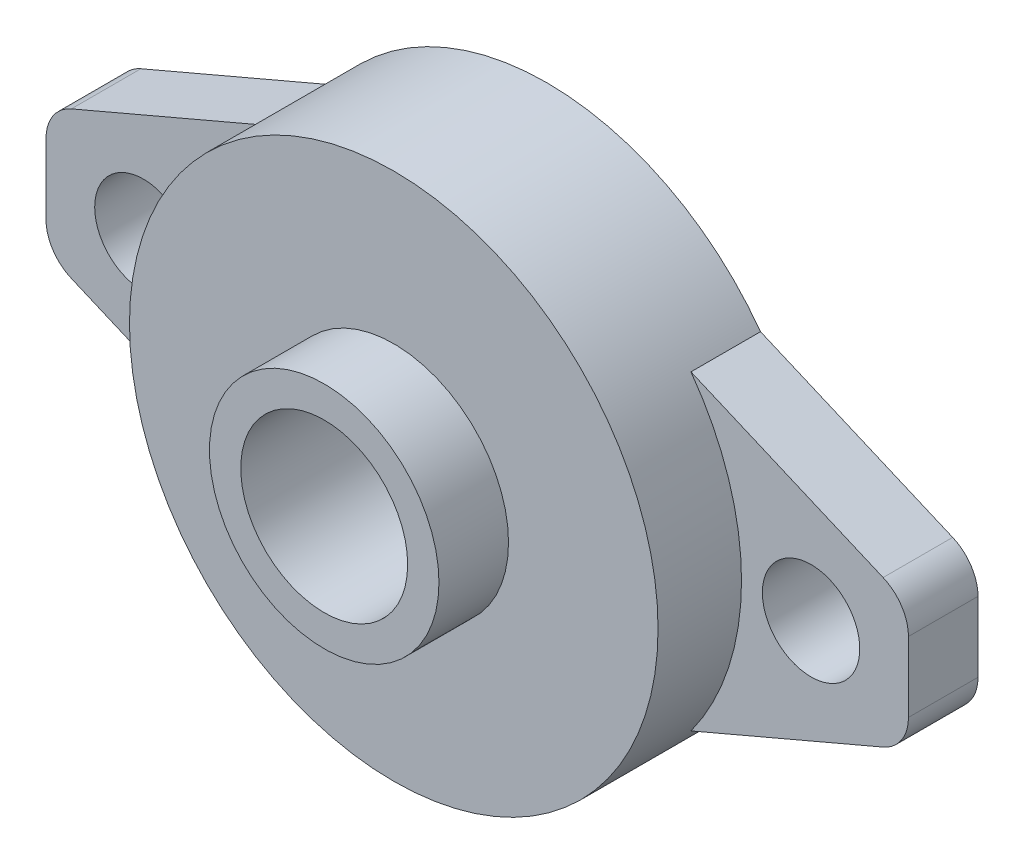
ISO-10303-21;
HEADER;
FILE_DESCRIPTION(('STEP AP214'),'2;1');
FILE_NAME('part.step','',(''),(''),'','','');
FILE_SCHEMA(('AUTOMOTIVE_DESIGN { 1 0 10303 214 1 1 1 1 }'));
ENDSEC;
DATA;
#1=APPLICATION_CONTEXT('core data for automotive mechanical design processes');
#2=APPLICATION_PROTOCOL_DEFINITION('international standard','automotive_design',2000,#1);
#3=PRODUCT_CONTEXT('',#1,'mechanical');
#4=PRODUCT('Part','Part','',(#3));
#5=PRODUCT_RELATED_PRODUCT_CATEGORY('part','',(#4));
#6=PRODUCT_DEFINITION_FORMATION('','',#4);
#7=PRODUCT_DEFINITION_CONTEXT('part definition',#1,'design');
#8=PRODUCT_DEFINITION('design','',#6,#7);
#9=PRODUCT_DEFINITION_SHAPE('','',#8);
#10=(LENGTH_UNIT() NAMED_UNIT(*) SI_UNIT(.MILLI.,.METRE.));
#11=(NAMED_UNIT(*) PLANE_ANGLE_UNIT() SI_UNIT($,.RADIAN.));
#12=(NAMED_UNIT(*) SI_UNIT($,.STERADIAN.) SOLID_ANGLE_UNIT());
#13=UNCERTAINTY_MEASURE_WITH_UNIT(LENGTH_MEASURE(1.E-05),#10,'distance_accuracy_value','');
#14=(GEOMETRIC_REPRESENTATION_CONTEXT(3) GLOBAL_UNCERTAINTY_ASSIGNED_CONTEXT((#13)) GLOBAL_UNIT_ASSIGNED_CONTEXT((#10,
#11,#12)) REPRESENTATION_CONTEXT('',''));
#15=CARTESIAN_POINT('',(0.,0.,0.));
#16=DIRECTION('',(0.,0.,1.));
#17=DIRECTION('',(1.,0.,0.));
#18=AXIS2_PLACEMENT_3D('',#15,#16,#17);
#19=CARTESIAN_POINT('',(0.,0.,11.));
#20=DIRECTION('',(0.,0.,1.));
#21=DIRECTION('',(1.,0.,0.));
#22=AXIS2_PLACEMENT_3D('',#19,#20,#21);
#23=PLANE('',#22);
#24=CARTESIAN_POINT('',(0.,0.,11.));
#25=DIRECTION('',(0.,0.,1.));
#26=DIRECTION('',(1.,0.,0.));
#27=AXIS2_PLACEMENT_3D('',#24,#25,#26);
#28=CIRCLE('',#27,19.);
#29=CARTESIAN_POINT('',(19.,0.,11.));
#30=VERTEX_POINT('',#29);
#31=EDGE_CURVE('E208',#30,#30,#28,.T.);
#32=ORIENTED_EDGE('',*,*,#31,.T.);
#33=EDGE_LOOP('',(#32));
#34=FACE_BOUND('',#33,.T.);
#35=CARTESIAN_POINT('',(0.,0.,11.));
#36=DIRECTION('',(0.,0.,1.));
#37=DIRECTION('',(1.,0.,0.));
#38=AXIS2_PLACEMENT_3D('',#35,#36,#37);
#39=CIRCLE('',#38,8.25);
#40=CARTESIAN_POINT('',(8.25,0.,11.));
#41=VERTEX_POINT('',#40);
#42=EDGE_CURVE('E200',#41,#41,#39,.T.);
#43=ORIENTED_EDGE('',*,*,#42,.F.);
#44=EDGE_LOOP('',(#43));
#45=FACE_BOUND('',#44,.T.);
#46=ADVANCED_FACE('F33',(#34,#45),#23,.T.);
#47=CARTESIAN_POINT('',(0.,0.,0.));
#48=DIRECTION('',(0.,0.,1.));
#49=DIRECTION('',(1.,0.,0.));
#50=AXIS2_PLACEMENT_3D('',#47,#48,#49);
#51=PLANE('',#50);
#52=DIRECTION('',(3.13792202098916E-13,-1.,0.));
#53=VECTOR('',#52,1.);
#54=CARTESIAN_POINT('',(31.0000000000035,-4.49999999999506,0.));
#55=LINE('',#54,#53);
#56=CARTESIAN_POINT('',(31.0000000000013,2.51904148439057,0.));
#57=VERTEX_POINT('',#56);
#58=CARTESIAN_POINT('',(31.0000000000028,-2.51904148437958,0.));
#59=VERTEX_POINT('',#58);
#60=EDGE_CURVE('E190',#57,#59,#55,.T.);
#61=ORIENTED_EDGE('',*,*,#60,.T.);
#62=CARTESIAN_POINT('',(28.0000000000028,-2.51904148438053,0.));
#63=DIRECTION('',(0.,0.,1.));
#64=DIRECTION('',(1.,0.,0.));
#65=AXIS2_PLACEMENT_3D('',#62,#63,#64);
#66=CIRCLE('',#65,3.);
#67=CARTESIAN_POINT('',(29.1782094084252,-5.27799465359256,0.));
#68=VERTEX_POINT('',#67);
#69=EDGE_CURVE('E222',#59,#68,#66,.F.);
#70=ORIENTED_EDGE('',*,*,#69,.T.);
#71=DIRECTION('',(-0.91965105640401,-0.392736469474109,0.));
#72=VECTOR('',#71,1.);
#73=CARTESIAN_POINT('',(15.3646827155619,-11.1770535048425,0.));
#74=LINE('',#73,#72);
#75=CARTESIAN_POINT('',(15.3646827155619,-11.1770535048425,0.));
#76=VERTEX_POINT('',#75);
#77=EDGE_CURVE('E130',#68,#76,#74,.T.);
#78=ORIENTED_EDGE('',*,*,#77,.T.);
#79=CARTESIAN_POINT('',(0.,0.,0.));
#80=DIRECTION('',(0.,0.,1.));
#81=DIRECTION('',(1.,0.,0.));
#82=AXIS2_PLACEMENT_3D('',#79,#80,#81);
#83=CIRCLE('',#82,19.);
#84=CARTESIAN_POINT('',(-15.3646827155584,-11.1770535048474,0.));
#85=VERTEX_POINT('',#84);
#86=EDGE_CURVE('E122',#85,#76,#83,.T.);
#87=ORIENTED_EDGE('',*,*,#86,.F.);
#88=DIRECTION('',(-0.91965105640393,0.392736469474297,0.));
#89=VECTOR('',#88,1.);
#90=CARTESIAN_POINT('',(-15.3646827155584,-11.1770535048474,0.));
#91=LINE('',#90,#89);
#92=CARTESIAN_POINT('',(-29.1782094084249,-5.27799465359263,0.));
#93=VERTEX_POINT('',#92);
#94=EDGE_CURVE('E128',#85,#93,#91,.T.);
#95=ORIENTED_EDGE('',*,*,#94,.T.);
#96=CARTESIAN_POINT('',(-28.000000000002,-2.51904148438084,0.));
#97=DIRECTION('',(0.,0.,1.));
#98=DIRECTION('',(1.,0.,0.));
#99=AXIS2_PLACEMENT_3D('',#96,#97,#98);
#100=CIRCLE('',#99,3.);
#101=CARTESIAN_POINT('',(-31.000000000002,-2.51904148438084,0.));
#102=VERTEX_POINT('',#101);
#103=EDGE_CURVE('E218',#93,#102,#100,.F.);
#104=ORIENTED_EDGE('',*,*,#103,.T.);
#105=DIRECTION('',(0.,1.,0.));
#106=VECTOR('',#105,1.);
#107=CARTESIAN_POINT('',(-31.000000000002,4.5000000000048,0.));
#108=LINE('',#107,#106);
#109=CARTESIAN_POINT('',(-31.000000000002,2.51904148438932,0.));
#110=VERTEX_POINT('',#109);
#111=EDGE_CURVE('E155',#102,#110,#108,.T.);
#112=ORIENTED_EDGE('',*,*,#111,.T.);
#113=CARTESIAN_POINT('',(-28.000000000002,2.51904148438932,0.));
#114=DIRECTION('',(0.,0.,1.));
#115=DIRECTION('',(1.,0.,0.));
#116=AXIS2_PLACEMENT_3D('',#113,#114,#115);
#117=CIRCLE('',#116,3.);
#118=CARTESIAN_POINT('',(-29.1782094084235,5.27799465360172,0.));
#119=VERTEX_POINT('',#118);
#120=EDGE_CURVE('E216',#110,#119,#117,.F.);
#121=ORIENTED_EDGE('',*,*,#120,.T.);
#122=DIRECTION('',(0.919651056404134,0.39273646947382,0.));
#123=VECTOR('',#122,1.);
#124=CARTESIAN_POINT('',(-15.3646827155584,11.1770535048474,0.));
#125=LINE('',#124,#123);
#126=CARTESIAN_POINT('',(-15.3646827155584,11.1770535048474,0.));
#127=VERTEX_POINT('',#126);
#128=EDGE_CURVE('E159',#119,#127,#125,.T.);
#129=ORIENTED_EDGE('',*,*,#128,.T.);
#130=CARTESIAN_POINT('',(15.3646827155549,11.1770535048522,0.));
#131=VERTEX_POINT('',#130);
#132=EDGE_CURVE('E134',#131,#127,#83,.T.);
#133=ORIENTED_EDGE('',*,*,#132,.F.);
#134=DIRECTION('',(0.919651056404053,-0.392736469474008,0.));
#135=VECTOR('',#134,1.);
#136=CARTESIAN_POINT('',(15.3646827155549,11.1770535048522,0.));
#137=LINE('',#136,#135);
#138=CARTESIAN_POINT('',(29.1782094084233,5.27799465360179,0.));
#139=VERTEX_POINT('',#138);
#140=EDGE_CURVE('E174',#131,#139,#137,.T.);
#141=ORIENTED_EDGE('',*,*,#140,.T.);
#142=CARTESIAN_POINT('',(28.0000000000013,2.51904148438963,0.));
#143=DIRECTION('',(0.,0.,1.));
#144=DIRECTION('',(1.,0.,0.));
#145=AXIS2_PLACEMENT_3D('',#142,#143,#144);
#146=CIRCLE('',#145,3.);
#147=EDGE_CURVE('E220',#139,#57,#146,.F.);
#148=ORIENTED_EDGE('',*,*,#147,.T.);
#149=EDGE_LOOP('',(#61,#70,#78,#87,#95,#104,#112,#121,#129,#133,#141,#148));
#150=FACE_BOUND('',#149,.T.);
#151=CARTESIAN_POINT('',(0.,0.,0.));
#152=DIRECTION('',(0.,0.,1.));
#153=DIRECTION('',(1.,0.,0.));
#154=AXIS2_PLACEMENT_3D('',#151,#152,#153);
#155=CIRCLE('',#154,6.);
#156=CARTESIAN_POINT('',(6.,0.,0.));
#157=VERTEX_POINT('',#156);
#158=EDGE_CURVE('E135',#157,#157,#155,.T.);
#159=ORIENTED_EDGE('',*,*,#158,.T.);
#160=EDGE_LOOP('',(#159));
#161=FACE_BOUND('',#160,.T.);
#162=CARTESIAN_POINT('',(24.,7.53824486505382E-12,0.));
#163=DIRECTION('',(0.,0.,-1.));
#164=DIRECTION('',(-1.,0.,0.));
#165=AXIS2_PLACEMENT_3D('',#162,#163,#164);
#166=CIRCLE('',#165,3.50000000000215);
#167=CARTESIAN_POINT('',(20.4999999999979,7.53824486505382E-12,0.));
#168=VERTEX_POINT('',#167);
#169=EDGE_CURVE('E169',#168,#168,#166,.T.);
#170=ORIENTED_EDGE('',*,*,#169,.F.);
#171=EDGE_LOOP('',(#170));
#172=FACE_BOUND('',#171,.T.);
#173=CARTESIAN_POINT('',(-24.,0.,0.));
#174=DIRECTION('',(0.,0.,-1.));
#175=DIRECTION('',(-1.,0.,0.));
#176=AXIS2_PLACEMENT_3D('',#173,#174,#175);
#177=CIRCLE('',#176,3.5);
#178=CARTESIAN_POINT('',(-27.5,0.,0.));
#179=VERTEX_POINT('',#178);
#180=EDGE_CURVE('E162',#179,#179,#177,.T.);
#181=ORIENTED_EDGE('',*,*,#180,.F.);
#182=EDGE_LOOP('',(#181));
#183=FACE_BOUND('',#182,.T.);
#184=ADVANCED_FACE('F125',(#150,#161,#172,#183),#51,.F.);
#185=CARTESIAN_POINT('',(0.,0.,11.));
#186=DIRECTION('',(0.,0.,-1.));
#187=DIRECTION('',(-1.,0.,0.));
#188=AXIS2_PLACEMENT_3D('',#185,#186,#187);
#189=CYLINDRICAL_SURFACE('',#188,19.);
#190=ORIENTED_EDGE('',*,*,#132,.T.);
#191=DIRECTION('',(0.,0.,-1.));
#192=VECTOR('',#191,1.);
#193=CARTESIAN_POINT('',(-15.3646827155584,11.1770535048474,5.));
#194=LINE('',#193,#192);
#195=CARTESIAN_POINT('',(-15.3646827155584,11.1770535048474,5.));
#196=VERTEX_POINT('',#195);
#197=EDGE_CURVE('E148',#196,#127,#194,.T.);
#198=ORIENTED_EDGE('',*,*,#197,.F.);
#199=CARTESIAN_POINT('',(0.,0.,5.));
#200=DIRECTION('',(0.,0.,1.));
#201=DIRECTION('',(-1.,0.,0.));
#202=AXIS2_PLACEMENT_3D('',#199,#200,#201);
#203=CIRCLE('',#202,19.);
#204=CARTESIAN_POINT('',(-15.3646827155584,-11.1770535048474,5.));
#205=VERTEX_POINT('',#204);
#206=EDGE_CURVE('E144',#196,#205,#203,.T.);
#207=ORIENTED_EDGE('',*,*,#206,.T.);
#208=DIRECTION('',(0.,0.,-1.));
#209=VECTOR('',#208,1.);
#210=CARTESIAN_POINT('',(-15.3646827155584,-11.1770535048474,5.));
#211=LINE('',#210,#209);
#212=EDGE_CURVE('E138',#205,#85,#211,.T.);
#213=ORIENTED_EDGE('',*,*,#212,.T.);
#214=ORIENTED_EDGE('',*,*,#86,.T.);
#215=DIRECTION('',(0.,0.,-1.));
#216=VECTOR('',#215,1.);
#217=CARTESIAN_POINT('',(15.3646827155619,-11.1770535048425,5.));
#218=LINE('',#217,#216);
#219=CARTESIAN_POINT('',(15.3646827155619,-11.1770535048425,5.));
#220=VERTEX_POINT('',#219);
#221=EDGE_CURVE('E193',#220,#76,#218,.T.);
#222=ORIENTED_EDGE('',*,*,#221,.F.);
#223=CARTESIAN_POINT('',(0.,0.,5.));
#224=DIRECTION('',(0.,0.,1.));
#225=DIRECTION('',(-1.,0.,0.));
#226=AXIS2_PLACEMENT_3D('',#223,#224,#225);
#227=CIRCLE('',#226,19.);
#228=CARTESIAN_POINT('',(15.3646827155549,11.1770535048522,5.));
#229=VERTEX_POINT('',#228);
#230=EDGE_CURVE('E177',#220,#229,#227,.T.);
#231=ORIENTED_EDGE('',*,*,#230,.T.);
#232=DIRECTION('',(0.,0.,-1.));
#233=VECTOR('',#232,1.);
#234=CARTESIAN_POINT('',(15.3646827155549,11.1770535048522,5.));
#235=LINE('',#234,#233);
#236=EDGE_CURVE('E187',#229,#131,#235,.T.);
#237=ORIENTED_EDGE('',*,*,#236,.T.);
#238=EDGE_LOOP('',(#190,#198,#207,#213,#214,#222,#231,#237));
#239=FACE_BOUND('',#238,.T.);
#240=ORIENTED_EDGE('',*,*,#31,.F.);
#241=EDGE_LOOP('',(#240));
#242=FACE_BOUND('',#241,.T.);
#243=ADVANCED_FACE('F140',(#239,#242),#189,.T.);
#244=CARTESIAN_POINT('',(0.,0.,11.));
#245=DIRECTION('',(0.,0.,-1.));
#246=DIRECTION('',(-1.,0.,0.));
#247=AXIS2_PLACEMENT_3D('',#244,#245,#246);
#248=CYLINDRICAL_SURFACE('',#247,6.);
#249=ORIENTED_EDGE('',*,*,#158,.F.);
#250=EDGE_LOOP('',(#249));
#251=FACE_BOUND('',#250,.T.);
#252=CARTESIAN_POINT('',(0.,0.,16.));
#253=DIRECTION('',(0.,0.,1.));
#254=DIRECTION('',(1.,0.,0.));
#255=AXIS2_PLACEMENT_3D('',#252,#253,#254);
#256=CIRCLE('',#255,6.);
#257=CARTESIAN_POINT('',(6.,0.,16.));
#258=VERTEX_POINT('',#257);
#259=EDGE_CURVE('E195',#258,#258,#256,.T.);
#260=ORIENTED_EDGE('',*,*,#259,.T.);
#261=EDGE_LOOP('',(#260));
#262=FACE_BOUND('',#261,.T.);
#263=ADVANCED_FACE('F266',(#251,#262),#248,.F.);
#264=CARTESIAN_POINT('',(0.,0.,16.));
#265=DIRECTION('',(0.,0.,1.));
#266=DIRECTION('',(1.,0.,0.));
#267=AXIS2_PLACEMENT_3D('',#264,#265,#266);
#268=PLANE('',#267);
#269=CARTESIAN_POINT('',(0.,0.,16.));
#270=DIRECTION('',(0.,0.,1.));
#271=DIRECTION('',(1.,0.,0.));
#272=AXIS2_PLACEMENT_3D('',#269,#270,#271);
#273=CIRCLE('',#272,8.25);
#274=CARTESIAN_POINT('',(8.25,0.,16.));
#275=VERTEX_POINT('',#274);
#276=EDGE_CURVE('E201',#275,#275,#273,.T.);
#277=ORIENTED_EDGE('',*,*,#276,.T.);
#278=EDGE_LOOP('',(#277));
#279=FACE_BOUND('',#278,.T.);
#280=ORIENTED_EDGE('',*,*,#259,.F.);
#281=EDGE_LOOP('',(#280));
#282=FACE_BOUND('',#281,.T.);
#283=ADVANCED_FACE('F417',(#279,#282),#268,.T.);
#284=CARTESIAN_POINT('',(0.,0.,16.));
#285=DIRECTION('',(0.,0.,-1.));
#286=DIRECTION('',(-1.,0.,0.));
#287=AXIS2_PLACEMENT_3D('',#284,#285,#286);
#288=CYLINDRICAL_SURFACE('',#287,8.25);
#289=ORIENTED_EDGE('',*,*,#276,.F.);
#290=EDGE_LOOP('',(#289));
#291=FACE_BOUND('',#290,.T.);
#292=ORIENTED_EDGE('',*,*,#42,.T.);
#293=EDGE_LOOP('',(#292));
#294=FACE_BOUND('',#293,.T.);
#295=ADVANCED_FACE('F378',(#291,#294),#288,.T.);
#296=CARTESIAN_POINT('',(15.3646827155619,-11.1770535048425,5.));
#297=DIRECTION('',(0.392736469474109,-0.91965105640401,0.));
#298=DIRECTION('',(0.91965105640401,0.392736469474109,0.));
#299=AXIS2_PLACEMENT_3D('',#296,#297,#298);
#300=PLANE('',#299);
#301=ORIENTED_EDGE('',*,*,#77,.F.);
#302=DIRECTION('',(0.,0.,-1.));
#303=VECTOR('',#302,1.);
#304=CARTESIAN_POINT('',(29.1782094084252,-5.27799465359256,5.));
#305=LINE('',#304,#303);
#306=CARTESIAN_POINT('',(29.1782094084252,-5.27799465359256,5.));
#307=VERTEX_POINT('',#306);
#308=EDGE_CURVE('E224',#68,#307,#305,.F.);
#309=ORIENTED_EDGE('',*,*,#308,.T.);
#310=DIRECTION('',(-0.91965105640401,-0.392736469474109,0.));
#311=VECTOR('',#310,1.);
#312=CARTESIAN_POINT('',(15.3646827155619,-11.1770535048425,5.));
#313=LINE('',#312,#311);
#314=EDGE_CURVE('E185',#307,#220,#313,.T.);
#315=ORIENTED_EDGE('',*,*,#314,.T.);
#316=ORIENTED_EDGE('',*,*,#221,.T.);
#317=EDGE_LOOP('',(#301,#309,#315,#316));
#318=FACE_BOUND('',#317,.T.);
#319=ADVANCED_FACE('F369',(#318),#300,.T.);
#320=CARTESIAN_POINT('',(31.0000000000035,-4.49999999999506,5.));
#321=DIRECTION('',(1.,3.13792202098916E-13,0.));
#322=DIRECTION('',(-3.13792202098916E-13,1.,0.));
#323=AXIS2_PLACEMENT_3D('',#320,#321,#322);
#324=PLANE('',#323);
#325=DIRECTION('',(3.13792202098916E-13,-1.,0.));
#326=VECTOR('',#325,1.);
#327=CARTESIAN_POINT('',(31.0000000000035,-4.49999999999506,5.));
#328=LINE('',#327,#326);
#329=CARTESIAN_POINT('',(31.0000000000013,2.51904148439057,5.));
#330=VERTEX_POINT('',#329);
#331=CARTESIAN_POINT('',(31.0000000000028,-2.51904148437958,5.));
#332=VERTEX_POINT('',#331);
#333=EDGE_CURVE('E182',#330,#332,#328,.T.);
#334=ORIENTED_EDGE('',*,*,#333,.T.);
#335=DIRECTION('',(0.,0.,-1.));
#336=VECTOR('',#335,1.);
#337=CARTESIAN_POINT('',(31.0000000000028,-2.51904148437958,5.));
#338=LINE('',#337,#336);
#339=EDGE_CURVE('E213',#332,#59,#338,.T.);
#340=ORIENTED_EDGE('',*,*,#339,.T.);
#341=ORIENTED_EDGE('',*,*,#60,.F.);
#342=DIRECTION('',(0.,0.,-1.));
#343=VECTOR('',#342,1.);
#344=CARTESIAN_POINT('',(31.0000000000013,2.51904148439057,5.));
#345=LINE('',#344,#343);
#346=EDGE_CURVE('E210',#57,#330,#345,.F.);
#347=ORIENTED_EDGE('',*,*,#346,.T.);
#348=EDGE_LOOP('',(#334,#340,#341,#347));
#349=FACE_BOUND('',#348,.T.);
#350=ADVANCED_FACE('F359',(#349),#324,.T.);
#351=CARTESIAN_POINT('',(15.3646827155549,11.1770535048522,5.));
#352=DIRECTION('',(0.392736469474008,0.919651056404053,0.));
#353=DIRECTION('',(-0.919651056404053,0.392736469474008,0.));
#354=AXIS2_PLACEMENT_3D('',#351,#352,#353);
#355=PLANE('',#354);
#356=DIRECTION('',(0.919651056404053,-0.392736469474008,0.));
#357=VECTOR('',#356,1.);
#358=CARTESIAN_POINT('',(15.3646827155549,11.1770535048522,5.));
#359=LINE('',#358,#357);
#360=CARTESIAN_POINT('',(29.1782094084233,5.27799465360179,5.));
#361=VERTEX_POINT('',#360);
#362=EDGE_CURVE('E179',#229,#361,#359,.T.);
#363=ORIENTED_EDGE('',*,*,#362,.T.);
#364=DIRECTION('',(0.,0.,-1.));
#365=VECTOR('',#364,1.);
#366=CARTESIAN_POINT('',(29.1782094084233,5.27799465360179,5.));
#367=LINE('',#366,#365);
#368=EDGE_CURVE('E230',#361,#139,#367,.T.);
#369=ORIENTED_EDGE('',*,*,#368,.T.);
#370=ORIENTED_EDGE('',*,*,#140,.F.);
#371=ORIENTED_EDGE('',*,*,#236,.F.);
#372=EDGE_LOOP('',(#363,#369,#370,#371));
#373=FACE_BOUND('',#372,.T.);
#374=ADVANCED_FACE('F349',(#373),#355,.T.);
#375=CARTESIAN_POINT('',(0.,0.,5.));
#376=DIRECTION('',(0.,0.,-1.));
#377=DIRECTION('',(-1.,0.,0.));
#378=AXIS2_PLACEMENT_3D('',#375,#376,#377);
#379=PLANE('',#378);
#380=CARTESIAN_POINT('',(24.,7.53824486505382E-12,5.));
#381=DIRECTION('',(0.,0.,-1.));
#382=DIRECTION('',(-1.,0.,0.));
#383=AXIS2_PLACEMENT_3D('',#380,#381,#382);
#384=CIRCLE('',#383,3.50000000000215);
#385=CARTESIAN_POINT('',(20.4999999999979,7.53824486505382E-12,5.));
#386=VERTEX_POINT('',#385);
#387=EDGE_CURVE('E171',#386,#386,#384,.T.);
#388=ORIENTED_EDGE('',*,*,#387,.T.);
#389=EDGE_LOOP('',(#388));
#390=FACE_BOUND('',#389,.T.);
#391=ORIENTED_EDGE('',*,*,#314,.F.);
#392=CARTESIAN_POINT('',(28.0000000000028,-2.51904148438053,5.));
#393=DIRECTION('',(0.,0.,-1.));
#394=DIRECTION('',(-1.,0.,0.));
#395=AXIS2_PLACEMENT_3D('',#392,#393,#394);
#396=CIRCLE('',#395,3.);
#397=EDGE_CURVE('E228',#307,#332,#396,.F.);
#398=ORIENTED_EDGE('',*,*,#397,.T.);
#399=ORIENTED_EDGE('',*,*,#333,.F.);
#400=CARTESIAN_POINT('',(28.0000000000013,2.51904148438963,5.));
#401=DIRECTION('',(0.,0.,-1.));
#402=DIRECTION('',(-1.,0.,0.));
#403=AXIS2_PLACEMENT_3D('',#400,#401,#402);
#404=CIRCLE('',#403,3.);
#405=EDGE_CURVE('E226',#330,#361,#404,.F.);
#406=ORIENTED_EDGE('',*,*,#405,.T.);
#407=ORIENTED_EDGE('',*,*,#362,.F.);
#408=ORIENTED_EDGE('',*,*,#230,.F.);
#409=EDGE_LOOP('',(#391,#398,#399,#406,#407,#408));
#410=FACE_BOUND('',#409,.T.);
#411=ADVANCED_FACE('F344',(#390,#410),#379,.F.);
#412=CARTESIAN_POINT('',(24.,7.53824486505382E-12,5.));
#413=DIRECTION('',(0.,0.,-1.));
#414=DIRECTION('',(-1.,0.,0.));
#415=AXIS2_PLACEMENT_3D('',#412,#413,#414);
#416=CYLINDRICAL_SURFACE('',#415,3.50000000000215);
#417=ORIENTED_EDGE('',*,*,#387,.F.);
#418=EDGE_LOOP('',(#417));
#419=FACE_BOUND('',#418,.T.);
#420=ORIENTED_EDGE('',*,*,#169,.T.);
#421=EDGE_LOOP('',(#420));
#422=FACE_BOUND('',#421,.T.);
#423=ADVANCED_FACE('F337',(#419,#422),#416,.F.);
#424=CARTESIAN_POINT('',(-15.3646827155584,11.1770535048474,5.));
#425=DIRECTION('',(-0.39273646947382,0.919651056404134,0.));
#426=DIRECTION('',(-0.919651056404134,-0.39273646947382,0.));
#427=AXIS2_PLACEMENT_3D('',#424,#425,#426);
#428=PLANE('',#427);
#429=ORIENTED_EDGE('',*,*,#128,.F.);
#430=DIRECTION('',(0.,0.,-1.));
#431=VECTOR('',#430,1.);
#432=CARTESIAN_POINT('',(-29.1782094084235,5.27799465360172,5.));
#433=LINE('',#432,#431);
#434=CARTESIAN_POINT('',(-29.1782094084235,5.27799465360172,5.));
#435=VERTEX_POINT('',#434);
#436=EDGE_CURVE('E11',#119,#435,#433,.F.);
#437=ORIENTED_EDGE('',*,*,#436,.T.);
#438=DIRECTION('',(0.919651056404134,0.39273646947382,0.));
#439=VECTOR('',#438,1.);
#440=CARTESIAN_POINT('',(-15.3646827155584,11.1770535048474,5.));
#441=LINE('',#440,#439);
#442=EDGE_CURVE('E149',#435,#196,#441,.T.);
#443=ORIENTED_EDGE('',*,*,#442,.T.);
#444=ORIENTED_EDGE('',*,*,#197,.T.);
#445=EDGE_LOOP('',(#429,#437,#443,#444));
#446=FACE_BOUND('',#445,.T.);
#447=ADVANCED_FACE('F252',(#446),#428,.T.);
#448=CARTESIAN_POINT('',(-31.000000000002,4.5000000000048,5.));
#449=DIRECTION('',(-1.,0.,0.));
#450=DIRECTION('',(0.,0.,1.));
#451=AXIS2_PLACEMENT_3D('',#448,#449,#450);
#452=PLANE('',#451);
#453=ORIENTED_EDGE('',*,*,#111,.F.);
#454=DIRECTION('',(0.,0.,-1.));
#455=VECTOR('',#454,1.);
#456=CARTESIAN_POINT('',(-31.000000000002,-2.51904148438084,5.));
#457=LINE('',#456,#455);
#458=CARTESIAN_POINT('',(-31.000000000002,-2.51904148438084,5.));
#459=VERTEX_POINT('',#458);
#460=EDGE_CURVE('E237',#102,#459,#457,.F.);
#461=ORIENTED_EDGE('',*,*,#460,.T.);
#462=DIRECTION('',(0.,1.,0.));
#463=VECTOR('',#462,1.);
#464=CARTESIAN_POINT('',(-31.000000000002,4.5000000000048,5.));
#465=LINE('',#464,#463);
#466=CARTESIAN_POINT('',(-31.000000000002,2.51904148438932,5.));
#467=VERTEX_POINT('',#466);
#468=EDGE_CURVE('E242',#459,#467,#465,.T.);
#469=ORIENTED_EDGE('',*,*,#468,.T.);
#470=DIRECTION('',(0.,0.,-1.));
#471=VECTOR('',#470,1.);
#472=CARTESIAN_POINT('',(-31.000000000002,2.51904148438932,5.));
#473=LINE('',#472,#471);
#474=EDGE_CURVE('E234',#467,#110,#473,.T.);
#475=ORIENTED_EDGE('',*,*,#474,.T.);
#476=EDGE_LOOP('',(#453,#461,#469,#475));
#477=FACE_BOUND('',#476,.T.);
#478=ADVANCED_FACE('F249',(#477),#452,.T.);
#479=CARTESIAN_POINT('',(-15.3646827155584,-11.1770535048474,5.));
#480=DIRECTION('',(-0.392736469474297,-0.91965105640393,0.));
#481=DIRECTION('',(0.91965105640393,-0.392736469474297,0.));
#482=AXIS2_PLACEMENT_3D('',#479,#480,#481);
#483=PLANE('',#482);
#484=DIRECTION('',(-0.91965105640393,0.392736469474297,0.));
#485=VECTOR('',#484,1.);
#486=CARTESIAN_POINT('',(-15.3646827155584,-11.1770535048474,5.));
#487=LINE('',#486,#485);
#488=CARTESIAN_POINT('',(-29.1782094084249,-5.27799465359263,5.));
#489=VERTEX_POINT('',#488);
#490=EDGE_CURVE('E241',#205,#489,#487,.T.);
#491=ORIENTED_EDGE('',*,*,#490,.T.);
#492=DIRECTION('',(0.,0.,-1.));
#493=VECTOR('',#492,1.);
#494=CARTESIAN_POINT('',(-29.1782094084249,-5.27799465359263,5.));
#495=LINE('',#494,#493);
#496=EDGE_CURVE('E154',#489,#93,#495,.T.);
#497=ORIENTED_EDGE('',*,*,#496,.T.);
#498=ORIENTED_EDGE('',*,*,#94,.F.);
#499=ORIENTED_EDGE('',*,*,#212,.F.);
#500=EDGE_LOOP('',(#491,#497,#498,#499));
#501=FACE_BOUND('',#500,.T.);
#502=ADVANCED_FACE('F152',(#501),#483,.T.);
#503=CARTESIAN_POINT('',(0.,0.,5.));
#504=DIRECTION('',(0.,0.,-1.));
#505=DIRECTION('',(-1.,0.,0.));
#506=AXIS2_PLACEMENT_3D('',#503,#504,#505);
#507=PLANE('',#506);
#508=CARTESIAN_POINT('',(-24.,0.,5.));
#509=DIRECTION('',(0.,0.,-1.));
#510=DIRECTION('',(-1.,0.,0.));
#511=AXIS2_PLACEMENT_3D('',#508,#509,#510);
#512=CIRCLE('',#511,3.5);
#513=CARTESIAN_POINT('',(-27.5,0.,5.));
#514=VERTEX_POINT('',#513);
#515=EDGE_CURVE('E156',#514,#514,#512,.T.);
#516=ORIENTED_EDGE('',*,*,#515,.T.);
#517=EDGE_LOOP('',(#516));
#518=FACE_BOUND('',#517,.T.);
#519=ORIENTED_EDGE('',*,*,#468,.F.);
#520=CARTESIAN_POINT('',(-28.000000000002,-2.51904148438084,5.));
#521=DIRECTION('',(0.,0.,-1.));
#522=DIRECTION('',(-1.,0.,0.));
#523=AXIS2_PLACEMENT_3D('',#520,#521,#522);
#524=CIRCLE('',#523,3.);
#525=EDGE_CURVE('E41',#459,#489,#524,.F.);
#526=ORIENTED_EDGE('',*,*,#525,.T.);
#527=ORIENTED_EDGE('',*,*,#490,.F.);
#528=ORIENTED_EDGE('',*,*,#206,.F.);
#529=ORIENTED_EDGE('',*,*,#442,.F.);
#530=CARTESIAN_POINT('',(-28.000000000002,2.51904148438932,5.));
#531=DIRECTION('',(0.,0.,-1.));
#532=DIRECTION('',(-1.,0.,0.));
#533=AXIS2_PLACEMENT_3D('',#530,#531,#532);
#534=CIRCLE('',#533,3.);
#535=EDGE_CURVE('E53',#435,#467,#534,.F.);
#536=ORIENTED_EDGE('',*,*,#535,.T.);
#537=EDGE_LOOP('',(#519,#526,#527,#528,#529,#536));
#538=FACE_BOUND('',#537,.T.);
#539=ADVANCED_FACE('F240',(#518,#538),#507,.F.);
#540=CARTESIAN_POINT('',(-24.,0.,5.));
#541=DIRECTION('',(0.,0.,-1.));
#542=DIRECTION('',(-1.,0.,0.));
#543=AXIS2_PLACEMENT_3D('',#540,#541,#542);
#544=CYLINDRICAL_SURFACE('',#543,3.5);
#545=ORIENTED_EDGE('',*,*,#515,.F.);
#546=EDGE_LOOP('',(#545));
#547=FACE_BOUND('',#546,.T.);
#548=ORIENTED_EDGE('',*,*,#180,.T.);
#549=EDGE_LOOP('',(#548));
#550=FACE_BOUND('',#549,.T.);
#551=ADVANCED_FACE('F258',(#547,#550),#544,.F.);
#552=CARTESIAN_POINT('',(28.0000000000028,-2.51904148438053,5.));
#553=DIRECTION('',(0.,0.,-1.));
#554=DIRECTION('',(-1.,0.,0.));
#555=AXIS2_PLACEMENT_3D('',#552,#553,#554);
#556=CYLINDRICAL_SURFACE('',#555,3.);
#557=ORIENTED_EDGE('',*,*,#397,.F.);
#558=ORIENTED_EDGE('',*,*,#308,.F.);
#559=ORIENTED_EDGE('',*,*,#69,.F.);
#560=ORIENTED_EDGE('',*,*,#339,.F.);
#561=EDGE_LOOP('',(#557,#558,#559,#560));
#562=FACE_BOUND('',#561,.T.);
#563=ADVANCED_FACE('F272',(#562),#556,.T.);
#564=CARTESIAN_POINT('',(28.0000000000013,2.51904148438963,5.));
#565=DIRECTION('',(0.,0.,-1.));
#566=DIRECTION('',(-1.,0.,0.));
#567=AXIS2_PLACEMENT_3D('',#564,#565,#566);
#568=CYLINDRICAL_SURFACE('',#567,3.);
#569=ORIENTED_EDGE('',*,*,#405,.F.);
#570=ORIENTED_EDGE('',*,*,#346,.F.);
#571=ORIENTED_EDGE('',*,*,#147,.F.);
#572=ORIENTED_EDGE('',*,*,#368,.F.);
#573=EDGE_LOOP('',(#569,#570,#571,#572));
#574=FACE_BOUND('',#573,.T.);
#575=ADVANCED_FACE('F275',(#574),#568,.T.);
#576=CARTESIAN_POINT('',(-28.000000000002,-2.51904148438084,5.));
#577=DIRECTION('',(0.,0.,-1.));
#578=DIRECTION('',(-1.,0.,0.));
#579=AXIS2_PLACEMENT_3D('',#576,#577,#578);
#580=CYLINDRICAL_SURFACE('',#579,3.);
#581=ORIENTED_EDGE('',*,*,#525,.F.);
#582=ORIENTED_EDGE('',*,*,#460,.F.);
#583=ORIENTED_EDGE('',*,*,#103,.F.);
#584=ORIENTED_EDGE('',*,*,#496,.F.);
#585=EDGE_LOOP('',(#581,#582,#583,#584));
#586=FACE_BOUND('',#585,.T.);
#587=ADVANCED_FACE('F246',(#586),#580,.T.);
#588=CARTESIAN_POINT('',(-28.000000000002,2.51904148438932,5.));
#589=DIRECTION('',(0.,0.,-1.));
#590=DIRECTION('',(-1.,0.,0.));
#591=AXIS2_PLACEMENT_3D('',#588,#589,#590);
#592=CYLINDRICAL_SURFACE('',#591,3.);
#593=ORIENTED_EDGE('',*,*,#535,.F.);
#594=ORIENTED_EDGE('',*,*,#436,.F.);
#595=ORIENTED_EDGE('',*,*,#120,.F.);
#596=ORIENTED_EDGE('',*,*,#474,.F.);
#597=EDGE_LOOP('',(#593,#594,#595,#596));
#598=FACE_BOUND('',#597,.T.);
#599=ADVANCED_FACE('F35',(#598),#592,.T.);
#600=CLOSED_SHELL('',(#46,#184,#243,#263,#283,#295,#319,#350,#374,#411,#423,#447,#478,#502,#539,
#551,#563,#575,#587,#599));
#601=MANIFOLD_SOLID_BREP('B2',#600);
#602=ADVANCED_BREP_SHAPE_REPRESENTATION('',(#18,#601),#14);
#603=SHAPE_DEFINITION_REPRESENTATION(#9,#602);
ENDSEC;
END-ISO-10303-21;
